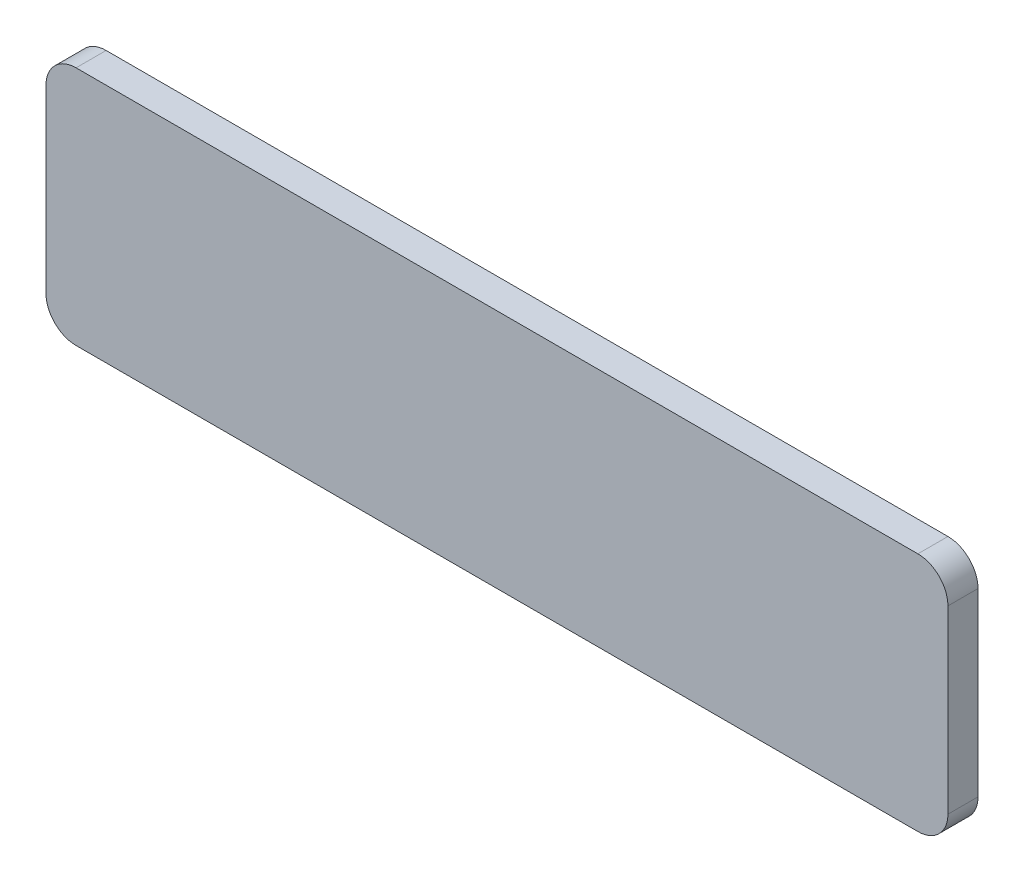
ISO-10303-21;
HEADER;
FILE_DESCRIPTION(('STEP AP214'),'2;1');
FILE_NAME('part.step','',(''),(''),'','','');
FILE_SCHEMA(('AUTOMOTIVE_DESIGN { 1 0 10303 214 1 1 1 1 }'));
ENDSEC;
DATA;
#1=APPLICATION_CONTEXT('core data for automotive mechanical design processes');
#2=APPLICATION_PROTOCOL_DEFINITION('international standard','automotive_design',2000,#1);
#3=PRODUCT_CONTEXT('',#1,'mechanical');
#4=PRODUCT('Part','Part','',(#3));
#5=PRODUCT_RELATED_PRODUCT_CATEGORY('part','',(#4));
#6=PRODUCT_DEFINITION_FORMATION('','',#4);
#7=PRODUCT_DEFINITION_CONTEXT('part definition',#1,'design');
#8=PRODUCT_DEFINITION('design','',#6,#7);
#9=PRODUCT_DEFINITION_SHAPE('','',#8);
#10=(LENGTH_UNIT() NAMED_UNIT(*) SI_UNIT(.MILLI.,.METRE.));
#11=(NAMED_UNIT(*) PLANE_ANGLE_UNIT() SI_UNIT($,.RADIAN.));
#12=(NAMED_UNIT(*) SI_UNIT($,.STERADIAN.) SOLID_ANGLE_UNIT());
#13=UNCERTAINTY_MEASURE_WITH_UNIT(LENGTH_MEASURE(1.E-05),#10,'distance_accuracy_value','');
#14=(GEOMETRIC_REPRESENTATION_CONTEXT(3) GLOBAL_UNCERTAINTY_ASSIGNED_CONTEXT((#13)) GLOBAL_UNIT_ASSIGNED_CONTEXT((#10,
#11,#12)) REPRESENTATION_CONTEXT('',''));
#15=CARTESIAN_POINT('',(0.,0.,0.));
#16=DIRECTION('',(0.,0.,1.));
#17=DIRECTION('',(1.,0.,0.));
#18=AXIS2_PLACEMENT_3D('',#15,#16,#17);
#19=CARTESIAN_POINT('',(29.,7.,1.));
#20=DIRECTION('',(0.,0.,-1.));
#21=DIRECTION('',(-1.,0.,0.));
#22=AXIS2_PLACEMENT_3D('',#19,#20,#21);
#23=CYLINDRICAL_SURFACE('',#22,1.);
#24=CARTESIAN_POINT('',(29.,7.,0.));
#25=DIRECTION('',(0.,0.,1.));
#26=DIRECTION('',(-1.,0.,0.));
#27=AXIS2_PLACEMENT_3D('',#24,#25,#26);
#28=CIRCLE('',#27,1.);
#29=CARTESIAN_POINT('',(30.,7.,0.));
#30=VERTEX_POINT('',#29);
#31=CARTESIAN_POINT('',(29.,8.,0.));
#32=VERTEX_POINT('',#31);
#33=EDGE_CURVE('E134',#30,#32,#28,.T.);
#34=ORIENTED_EDGE('',*,*,#33,.T.);
#35=DIRECTION('',(0.,0.,-1.));
#36=VECTOR('',#35,1.);
#37=CARTESIAN_POINT('',(29.,8.,1.));
#38=LINE('',#37,#36);
#39=CARTESIAN_POINT('',(29.,8.,1.));
#40=VERTEX_POINT('',#39);
#41=EDGE_CURVE('E11',#40,#32,#38,.T.);
#42=ORIENTED_EDGE('',*,*,#41,.F.);
#43=CARTESIAN_POINT('',(29.,7.,1.));
#44=DIRECTION('',(0.,0.,1.));
#45=DIRECTION('',(-1.,0.,0.));
#46=AXIS2_PLACEMENT_3D('',#43,#44,#45);
#47=CIRCLE('',#46,1.);
#48=CARTESIAN_POINT('',(30.,7.,1.));
#49=VERTEX_POINT('',#48);
#50=EDGE_CURVE('E148',#49,#40,#47,.T.);
#51=ORIENTED_EDGE('',*,*,#50,.F.);
#52=DIRECTION('',(0.,0.,-1.));
#53=VECTOR('',#52,1.);
#54=CARTESIAN_POINT('',(30.,7.,1.));
#55=LINE('',#54,#53);
#56=EDGE_CURVE('E130',#49,#30,#55,.T.);
#57=ORIENTED_EDGE('',*,*,#56,.T.);
#58=EDGE_LOOP('',(#34,#42,#51,#57));
#59=FACE_BOUND('',#58,.T.);
#60=ADVANCED_FACE('F38',(#59),#23,.T.);
#61=CARTESIAN_POINT('',(1.,8.,1.));
#62=DIRECTION('',(0.,-1.,0.));
#63=DIRECTION('',(0.,0.,-1.));
#64=AXIS2_PLACEMENT_3D('',#61,#62,#63);
#65=PLANE('',#64);
#66=DIRECTION('',(-1.,0.,0.));
#67=VECTOR('',#66,1.);
#68=CARTESIAN_POINT('',(1.,8.,0.));
#69=LINE('',#68,#67);
#70=CARTESIAN_POINT('',(1.,8.,0.));
#71=VERTEX_POINT('',#70);
#72=EDGE_CURVE('E137',#32,#71,#69,.T.);
#73=ORIENTED_EDGE('',*,*,#72,.T.);
#74=DIRECTION('',(0.,0.,-1.));
#75=VECTOR('',#74,1.);
#76=CARTESIAN_POINT('',(1.,8.,1.));
#77=LINE('',#76,#75);
#78=CARTESIAN_POINT('',(1.,8.,1.));
#79=VERTEX_POINT('',#78);
#80=EDGE_CURVE('E46',#79,#71,#77,.T.);
#81=ORIENTED_EDGE('',*,*,#80,.F.);
#82=DIRECTION('',(-1.,0.,0.));
#83=VECTOR('',#82,1.);
#84=CARTESIAN_POINT('',(1.,8.,1.));
#85=LINE('',#84,#83);
#86=EDGE_CURVE('E97',#40,#79,#85,.T.);
#87=ORIENTED_EDGE('',*,*,#86,.F.);
#88=ORIENTED_EDGE('',*,*,#41,.T.);
#89=EDGE_LOOP('',(#73,#81,#87,#88));
#90=FACE_BOUND('',#89,.T.);
#91=ADVANCED_FACE('F183',(#90),#65,.F.);
#92=CARTESIAN_POINT('',(1.,7.,1.));
#93=DIRECTION('',(0.,0.,-1.));
#94=DIRECTION('',(-1.,0.,0.));
#95=AXIS2_PLACEMENT_3D('',#92,#93,#94);
#96=CYLINDRICAL_SURFACE('',#95,1.);
#97=CARTESIAN_POINT('',(1.,7.,0.));
#98=DIRECTION('',(0.,0.,1.));
#99=DIRECTION('',(-1.,0.,0.));
#100=AXIS2_PLACEMENT_3D('',#97,#98,#99);
#101=CIRCLE('',#100,1.);
#102=CARTESIAN_POINT('',(0.,7.,0.));
#103=VERTEX_POINT('',#102);
#104=EDGE_CURVE('E139',#71,#103,#101,.T.);
#105=ORIENTED_EDGE('',*,*,#104,.T.);
#106=DIRECTION('',(0.,0.,-1.));
#107=VECTOR('',#106,1.);
#108=CARTESIAN_POINT('',(0.,7.,1.));
#109=LINE('',#108,#107);
#110=CARTESIAN_POINT('',(0.,7.,1.));
#111=VERTEX_POINT('',#110);
#112=EDGE_CURVE('E155',#111,#103,#109,.T.);
#113=ORIENTED_EDGE('',*,*,#112,.F.);
#114=CARTESIAN_POINT('',(1.,7.,1.));
#115=DIRECTION('',(0.,0.,1.));
#116=DIRECTION('',(-1.,0.,0.));
#117=AXIS2_PLACEMENT_3D('',#114,#115,#116);
#118=CIRCLE('',#117,1.);
#119=EDGE_CURVE('E163',#79,#111,#118,.T.);
#120=ORIENTED_EDGE('',*,*,#119,.F.);
#121=ORIENTED_EDGE('',*,*,#80,.T.);
#122=EDGE_LOOP('',(#105,#113,#120,#121));
#123=FACE_BOUND('',#122,.T.);
#124=ADVANCED_FACE('F161',(#123),#96,.T.);
#125=CARTESIAN_POINT('',(0.,1.00000000000001,1.));
#126=DIRECTION('',(1.,0.,0.));
#127=DIRECTION('',(0.,0.,-1.));
#128=AXIS2_PLACEMENT_3D('',#125,#126,#127);
#129=PLANE('',#128);
#130=DIRECTION('',(0.,-1.,0.));
#131=VECTOR('',#130,1.);
#132=CARTESIAN_POINT('',(0.,1.00000000000001,0.));
#133=LINE('',#132,#131);
#134=CARTESIAN_POINT('',(0.,1.00000000000001,0.));
#135=VERTEX_POINT('',#134);
#136=EDGE_CURVE('E141',#103,#135,#133,.T.);
#137=ORIENTED_EDGE('',*,*,#136,.T.);
#138=DIRECTION('',(0.,0.,-1.));
#139=VECTOR('',#138,1.);
#140=CARTESIAN_POINT('',(0.,1.00000000000001,1.));
#141=LINE('',#140,#139);
#142=CARTESIAN_POINT('',(0.,1.00000000000001,1.));
#143=VERTEX_POINT('',#142);
#144=EDGE_CURVE('E152',#143,#135,#141,.T.);
#145=ORIENTED_EDGE('',*,*,#144,.F.);
#146=DIRECTION('',(0.,-1.,0.));
#147=VECTOR('',#146,1.);
#148=CARTESIAN_POINT('',(0.,1.00000000000001,1.));
#149=LINE('',#148,#147);
#150=EDGE_CURVE('E175',#111,#143,#149,.T.);
#151=ORIENTED_EDGE('',*,*,#150,.F.);
#152=ORIENTED_EDGE('',*,*,#112,.T.);
#153=EDGE_LOOP('',(#137,#145,#151,#152));
#154=FACE_BOUND('',#153,.T.);
#155=ADVANCED_FACE('F171',(#154),#129,.F.);
#156=CARTESIAN_POINT('',(1.,1.,1.));
#157=DIRECTION('',(0.,0.,-1.));
#158=DIRECTION('',(-1.,0.,0.));
#159=AXIS2_PLACEMENT_3D('',#156,#157,#158);
#160=CYLINDRICAL_SURFACE('',#159,1.);
#161=CARTESIAN_POINT('',(1.,1.,0.));
#162=DIRECTION('',(0.,0.,1.));
#163=DIRECTION('',(1.,0.,0.));
#164=AXIS2_PLACEMENT_3D('',#161,#162,#163);
#165=CIRCLE('',#164,1.);
#166=CARTESIAN_POINT('',(1.00000000000001,0.,0.));
#167=VERTEX_POINT('',#166);
#168=EDGE_CURVE('E143',#135,#167,#165,.T.);
#169=ORIENTED_EDGE('',*,*,#168,.T.);
#170=DIRECTION('',(0.,0.,-1.));
#171=VECTOR('',#170,1.);
#172=CARTESIAN_POINT('',(1.00000000000001,0.,1.));
#173=LINE('',#172,#171);
#174=CARTESIAN_POINT('',(1.00000000000001,0.,1.));
#175=VERTEX_POINT('',#174);
#176=EDGE_CURVE('E125',#175,#167,#173,.T.);
#177=ORIENTED_EDGE('',*,*,#176,.F.);
#178=CARTESIAN_POINT('',(1.,1.,1.));
#179=DIRECTION('',(0.,0.,1.));
#180=DIRECTION('',(1.,0.,0.));
#181=AXIS2_PLACEMENT_3D('',#178,#179,#180);
#182=CIRCLE('',#181,1.);
#183=EDGE_CURVE('E116',#143,#175,#182,.T.);
#184=ORIENTED_EDGE('',*,*,#183,.F.);
#185=ORIENTED_EDGE('',*,*,#144,.T.);
#186=EDGE_LOOP('',(#169,#177,#184,#185));
#187=FACE_BOUND('',#186,.T.);
#188=ADVANCED_FACE('F174',(#187),#160,.T.);
#189=CARTESIAN_POINT('',(1.00000000000001,0.,1.));
#190=DIRECTION('',(0.,1.,0.));
#191=DIRECTION('',(0.,0.,1.));
#192=AXIS2_PLACEMENT_3D('',#189,#190,#191);
#193=PLANE('',#192);
#194=DIRECTION('',(1.,0.,0.));
#195=VECTOR('',#194,1.);
#196=CARTESIAN_POINT('',(1.00000000000001,0.,0.));
#197=LINE('',#196,#195);
#198=CARTESIAN_POINT('',(29.,0.,0.));
#199=VERTEX_POINT('',#198);
#200=EDGE_CURVE('E124',#167,#199,#197,.T.);
#201=ORIENTED_EDGE('',*,*,#200,.T.);
#202=DIRECTION('',(0.,0.,-1.));
#203=VECTOR('',#202,1.);
#204=CARTESIAN_POINT('',(29.,0.,1.));
#205=LINE('',#204,#203);
#206=CARTESIAN_POINT('',(29.,0.,1.));
#207=VERTEX_POINT('',#206);
#208=EDGE_CURVE('E121',#207,#199,#205,.T.);
#209=ORIENTED_EDGE('',*,*,#208,.F.);
#210=DIRECTION('',(1.,0.,0.));
#211=VECTOR('',#210,1.);
#212=CARTESIAN_POINT('',(1.00000000000001,0.,1.));
#213=LINE('',#212,#211);
#214=EDGE_CURVE('E110',#175,#207,#213,.T.);
#215=ORIENTED_EDGE('',*,*,#214,.F.);
#216=ORIENTED_EDGE('',*,*,#176,.T.);
#217=EDGE_LOOP('',(#201,#209,#215,#216));
#218=FACE_BOUND('',#217,.T.);
#219=ADVANCED_FACE('F122',(#218),#193,.F.);
#220=CARTESIAN_POINT('',(29.,1.,1.));
#221=DIRECTION('',(0.,0.,-1.));
#222=DIRECTION('',(-1.,0.,0.));
#223=AXIS2_PLACEMENT_3D('',#220,#221,#222);
#224=CYLINDRICAL_SURFACE('',#223,1.);
#225=CARTESIAN_POINT('',(29.,1.,0.));
#226=DIRECTION('',(0.,0.,1.));
#227=DIRECTION('',(-1.,0.,0.));
#228=AXIS2_PLACEMENT_3D('',#225,#226,#227);
#229=CIRCLE('',#228,1.);
#230=CARTESIAN_POINT('',(30.,1.,0.));
#231=VERTEX_POINT('',#230);
#232=EDGE_CURVE('E83',#199,#231,#229,.T.);
#233=ORIENTED_EDGE('',*,*,#232,.T.);
#234=DIRECTION('',(0.,0.,-1.));
#235=VECTOR('',#234,1.);
#236=CARTESIAN_POINT('',(30.,1.,1.));
#237=LINE('',#236,#235);
#238=CARTESIAN_POINT('',(30.,1.,1.));
#239=VERTEX_POINT('',#238);
#240=EDGE_CURVE('E126',#239,#231,#237,.T.);
#241=ORIENTED_EDGE('',*,*,#240,.F.);
#242=CARTESIAN_POINT('',(29.,1.,1.));
#243=DIRECTION('',(0.,0.,1.));
#244=DIRECTION('',(-1.,0.,0.));
#245=AXIS2_PLACEMENT_3D('',#242,#243,#244);
#246=CIRCLE('',#245,1.);
#247=EDGE_CURVE('E114',#207,#239,#246,.T.);
#248=ORIENTED_EDGE('',*,*,#247,.F.);
#249=ORIENTED_EDGE('',*,*,#208,.T.);
#250=EDGE_LOOP('',(#233,#241,#248,#249));
#251=FACE_BOUND('',#250,.T.);
#252=ADVANCED_FACE('F128',(#251),#224,.T.);
#253=CARTESIAN_POINT('',(30.,1.,1.));
#254=DIRECTION('',(-1.,0.,0.));
#255=DIRECTION('',(0.,0.,1.));
#256=AXIS2_PLACEMENT_3D('',#253,#254,#255);
#257=PLANE('',#256);
#258=DIRECTION('',(0.,1.,0.));
#259=VECTOR('',#258,1.);
#260=CARTESIAN_POINT('',(30.,1.,0.));
#261=LINE('',#260,#259);
#262=EDGE_CURVE('E89',#231,#30,#261,.T.);
#263=ORIENTED_EDGE('',*,*,#262,.T.);
#264=ORIENTED_EDGE('',*,*,#56,.F.);
#265=DIRECTION('',(0.,1.,0.));
#266=VECTOR('',#265,1.);
#267=CARTESIAN_POINT('',(30.,1.,1.));
#268=LINE('',#267,#266);
#269=EDGE_CURVE('E54',#239,#49,#268,.T.);
#270=ORIENTED_EDGE('',*,*,#269,.F.);
#271=ORIENTED_EDGE('',*,*,#240,.T.);
#272=EDGE_LOOP('',(#263,#264,#270,#271));
#273=FACE_BOUND('',#272,.T.);
#274=ADVANCED_FACE('F199',(#273),#257,.F.);
#275=CARTESIAN_POINT('',(29.,7.,1.));
#276=DIRECTION('',(0.,0.,-1.));
#277=DIRECTION('',(-1.,0.,0.));
#278=AXIS2_PLACEMENT_3D('',#275,#276,#277);
#279=PLANE('',#278);
#280=ORIENTED_EDGE('',*,*,#50,.T.);
#281=ORIENTED_EDGE('',*,*,#86,.T.);
#282=ORIENTED_EDGE('',*,*,#119,.T.);
#283=ORIENTED_EDGE('',*,*,#150,.T.);
#284=ORIENTED_EDGE('',*,*,#183,.T.);
#285=ORIENTED_EDGE('',*,*,#214,.T.);
#286=ORIENTED_EDGE('',*,*,#247,.T.);
#287=ORIENTED_EDGE('',*,*,#269,.T.);
#288=EDGE_LOOP('',(#280,#281,#282,#283,#284,#285,#286,#287));
#289=FACE_BOUND('',#288,.T.);
#290=ADVANCED_FACE('F112',(#289),#279,.F.);
#291=CARTESIAN_POINT('',(29.,7.,0.));
#292=DIRECTION('',(0.,0.,-1.));
#293=DIRECTION('',(-1.,0.,0.));
#294=AXIS2_PLACEMENT_3D('',#291,#292,#293);
#295=PLANE('',#294);
#296=ORIENTED_EDGE('',*,*,#33,.F.);
#297=ORIENTED_EDGE('',*,*,#262,.F.);
#298=ORIENTED_EDGE('',*,*,#232,.F.);
#299=ORIENTED_EDGE('',*,*,#200,.F.);
#300=ORIENTED_EDGE('',*,*,#168,.F.);
#301=ORIENTED_EDGE('',*,*,#136,.F.);
#302=ORIENTED_EDGE('',*,*,#104,.F.);
#303=ORIENTED_EDGE('',*,*,#72,.F.);
#304=EDGE_LOOP('',(#296,#297,#298,#299,#300,#301,#302,#303));
#305=FACE_BOUND('',#304,.T.);
#306=ADVANCED_FACE('F167',(#305),#295,.T.);
#307=CLOSED_SHELL('',(#60,#91,#124,#155,#188,#219,#252,#274,#290,#306));
#308=MANIFOLD_SOLID_BREP('B2',#307);
#309=ADVANCED_BREP_SHAPE_REPRESENTATION('',(#18,#308),#14);
#310=SHAPE_DEFINITION_REPRESENTATION(#9,#309);
ENDSEC;
END-ISO-10303-21;
